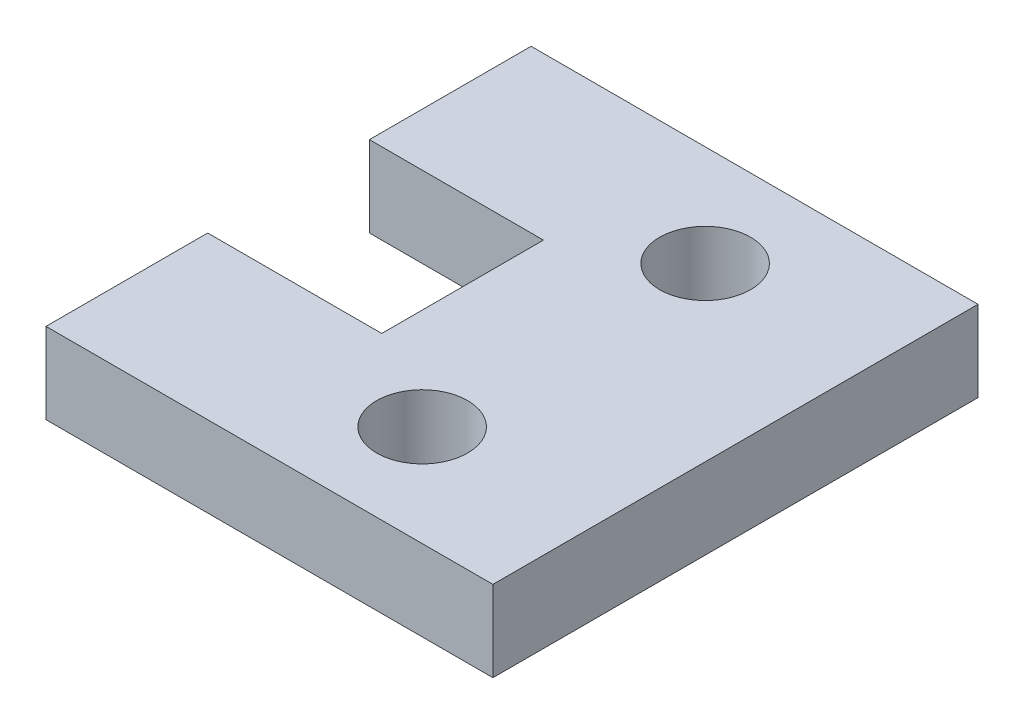
ISO-10303-21;
HEADER;
FILE_DESCRIPTION(('STEP AP214'),'2;1');
FILE_NAME('part.step','',(''),(''),'','','');
FILE_SCHEMA(('AUTOMOTIVE_DESIGN { 1 0 10303 214 1 1 1 1 }'));
ENDSEC;
DATA;
#1=APPLICATION_CONTEXT('core data for automotive mechanical design processes');
#2=APPLICATION_PROTOCOL_DEFINITION('international standard','automotive_design',2000,#1);
#3=PRODUCT_CONTEXT('',#1,'mechanical');
#4=PRODUCT('Part','Part','',(#3));
#5=PRODUCT_RELATED_PRODUCT_CATEGORY('part','',(#4));
#6=PRODUCT_DEFINITION_FORMATION('','',#4);
#7=PRODUCT_DEFINITION_CONTEXT('part definition',#1,'design');
#8=PRODUCT_DEFINITION('design','',#6,#7);
#9=PRODUCT_DEFINITION_SHAPE('','',#8);
#10=(LENGTH_UNIT() NAMED_UNIT(*) SI_UNIT(.MILLI.,.METRE.));
#11=(NAMED_UNIT(*) PLANE_ANGLE_UNIT() SI_UNIT($,.RADIAN.));
#12=(NAMED_UNIT(*) SI_UNIT($,.STERADIAN.) SOLID_ANGLE_UNIT());
#13=UNCERTAINTY_MEASURE_WITH_UNIT(LENGTH_MEASURE(1.E-05),#10,'distance_accuracy_value','');
#14=(GEOMETRIC_REPRESENTATION_CONTEXT(3) GLOBAL_UNCERTAINTY_ASSIGNED_CONTEXT((#13)) GLOBAL_UNIT_ASSIGNED_CONTEXT((#10,
#11,#12)) REPRESENTATION_CONTEXT('',''));
#15=CARTESIAN_POINT('',(0.,0.,0.));
#16=DIRECTION('',(0.,0.,1.));
#17=DIRECTION('',(1.,0.,0.));
#18=AXIS2_PLACEMENT_3D('',#15,#16,#17);
#19=CARTESIAN_POINT('',(-5.,4.,0.));
#20=DIRECTION('',(-1.,0.,0.));
#21=DIRECTION('',(0.,0.,1.));
#22=AXIS2_PLACEMENT_3D('',#19,#20,#21);
#23=PLANE('',#22);
#24=DIRECTION('',(0.,0.,-1.));
#25=VECTOR('',#24,1.);
#26=CARTESIAN_POINT('',(-5.,0.,0.));
#27=LINE('',#26,#25);
#28=CARTESIAN_POINT('',(-5.,0.,4.));
#29=VERTEX_POINT('',#28);
#30=CARTESIAN_POINT('',(-5.,0.,-4.));
#31=VERTEX_POINT('',#30);
#32=EDGE_CURVE('E136',#29,#31,#27,.T.);
#33=ORIENTED_EDGE('',*,*,#32,.F.);
#34=DIRECTION('',(0.,-1.,0.));
#35=VECTOR('',#34,1.);
#36=CARTESIAN_POINT('',(-5.,4.,4.));
#37=LINE('',#36,#35);
#38=CARTESIAN_POINT('',(-5.,4.,4.));
#39=VERTEX_POINT('',#38);
#40=EDGE_CURVE('E11',#39,#29,#37,.T.);
#41=ORIENTED_EDGE('',*,*,#40,.F.);
#42=DIRECTION('',(0.,0.,-1.));
#43=VECTOR('',#42,1.);
#44=CARTESIAN_POINT('',(-5.,4.,0.));
#45=LINE('',#44,#43);
#46=CARTESIAN_POINT('',(-5.,4.,-4.));
#47=VERTEX_POINT('',#46);
#48=EDGE_CURVE('E159',#39,#47,#45,.T.);
#49=ORIENTED_EDGE('',*,*,#48,.T.);
#50=DIRECTION('',(0.,-1.,0.));
#51=VECTOR('',#50,1.);
#52=CARTESIAN_POINT('',(-5.,4.,-4.));
#53=LINE('',#52,#51);
#54=EDGE_CURVE('E88',#47,#31,#53,.T.);
#55=ORIENTED_EDGE('',*,*,#54,.T.);
#56=EDGE_LOOP('',(#33,#41,#49,#55));
#57=FACE_BOUND('',#56,.T.);
#58=ADVANCED_FACE('F37',(#57),#23,.T.);
#59=CARTESIAN_POINT('',(0.,4.,4.));
#60=DIRECTION('',(0.,0.,1.));
#61=DIRECTION('',(1.,0.,0.));
#62=AXIS2_PLACEMENT_3D('',#59,#60,#61);
#63=PLANE('',#62);
#64=DIRECTION('',(-1.,0.,0.));
#65=VECTOR('',#64,1.);
#66=CARTESIAN_POINT('',(0.,0.,4.));
#67=LINE('',#66,#65);
#68=CARTESIAN_POINT('',(-13.60994599,0.,4.));
#69=VERTEX_POINT('',#68);
#70=EDGE_CURVE('E139',#29,#69,#67,.T.);
#71=ORIENTED_EDGE('',*,*,#70,.T.);
#72=DIRECTION('',(0.,-1.,0.));
#73=VECTOR('',#72,1.);
#74=CARTESIAN_POINT('',(-13.60994599,4.,4.));
#75=LINE('',#74,#73);
#76=CARTESIAN_POINT('',(-13.60994599,4.,4.));
#77=VERTEX_POINT('',#76);
#78=EDGE_CURVE('E45',#77,#69,#75,.T.);
#79=ORIENTED_EDGE('',*,*,#78,.F.);
#80=DIRECTION('',(-1.,0.,0.));
#81=VECTOR('',#80,1.);
#82=CARTESIAN_POINT('',(0.,4.,4.));
#83=LINE('',#82,#81);
#84=EDGE_CURVE('E188',#39,#77,#83,.T.);
#85=ORIENTED_EDGE('',*,*,#84,.F.);
#86=ORIENTED_EDGE('',*,*,#40,.T.);
#87=EDGE_LOOP('',(#71,#79,#85,#86));
#88=FACE_BOUND('',#87,.T.);
#89=ADVANCED_FACE('F192',(#88),#63,.F.);
#90=CARTESIAN_POINT('',(-13.60994599,4.,0.));
#91=DIRECTION('',(1.,0.,0.));
#92=DIRECTION('',(0.,0.,-1.));
#93=AXIS2_PLACEMENT_3D('',#90,#91,#92);
#94=PLANE('',#93);
#95=DIRECTION('',(0.,0.,1.));
#96=VECTOR('',#95,1.);
#97=CARTESIAN_POINT('',(-13.60994599,0.,0.));
#98=LINE('',#97,#96);
#99=CARTESIAN_POINT('',(-13.60994599,0.,12.));
#100=VERTEX_POINT('',#99);
#101=EDGE_CURVE('E141',#69,#100,#98,.T.);
#102=ORIENTED_EDGE('',*,*,#101,.T.);
#103=DIRECTION('',(0.,-1.,0.));
#104=VECTOR('',#103,1.);
#105=CARTESIAN_POINT('',(-13.60994599,4.,12.));
#106=LINE('',#105,#104);
#107=CARTESIAN_POINT('',(-13.60994599,4.,12.));
#108=VERTEX_POINT('',#107);
#109=EDGE_CURVE('E165',#108,#100,#106,.T.);
#110=ORIENTED_EDGE('',*,*,#109,.F.);
#111=DIRECTION('',(0.,0.,1.));
#112=VECTOR('',#111,1.);
#113=CARTESIAN_POINT('',(-13.60994599,4.,0.));
#114=LINE('',#113,#112);
#115=EDGE_CURVE('E174',#77,#108,#114,.T.);
#116=ORIENTED_EDGE('',*,*,#115,.F.);
#117=ORIENTED_EDGE('',*,*,#78,.T.);
#118=EDGE_LOOP('',(#102,#110,#116,#117));
#119=FACE_BOUND('',#118,.T.);
#120=ADVANCED_FACE('F172',(#119),#94,.F.);
#121=CARTESIAN_POINT('',(0.,4.,12.));
#122=DIRECTION('',(0.,0.,-1.));
#123=DIRECTION('',(-1.,0.,0.));
#124=AXIS2_PLACEMENT_3D('',#121,#122,#123);
#125=PLANE('',#124);
#126=DIRECTION('',(1.,0.,0.));
#127=VECTOR('',#126,1.);
#128=CARTESIAN_POINT('',(0.,0.,12.));
#129=LINE('',#128,#127);
#130=CARTESIAN_POINT('',(8.5,0.,12.));
#131=VERTEX_POINT('',#130);
#132=EDGE_CURVE('E143',#100,#131,#129,.T.);
#133=ORIENTED_EDGE('',*,*,#132,.T.);
#134=DIRECTION('',(0.,-1.,0.));
#135=VECTOR('',#134,1.);
#136=CARTESIAN_POINT('',(8.5,4.,12.));
#137=LINE('',#136,#135);
#138=CARTESIAN_POINT('',(8.5,4.,12.));
#139=VERTEX_POINT('',#138);
#140=EDGE_CURVE('E163',#139,#131,#137,.T.);
#141=ORIENTED_EDGE('',*,*,#140,.F.);
#142=DIRECTION('',(1.,0.,0.));
#143=VECTOR('',#142,1.);
#144=CARTESIAN_POINT('',(0.,4.,12.));
#145=LINE('',#144,#143);
#146=EDGE_CURVE('E186',#108,#139,#145,.T.);
#147=ORIENTED_EDGE('',*,*,#146,.F.);
#148=ORIENTED_EDGE('',*,*,#109,.T.);
#149=EDGE_LOOP('',(#133,#141,#147,#148));
#150=FACE_BOUND('',#149,.T.);
#151=ADVANCED_FACE('F184',(#150),#125,.F.);
#152=CARTESIAN_POINT('',(8.5,4.,0.));
#153=DIRECTION('',(1.,0.,0.));
#154=DIRECTION('',(0.,0.,-1.));
#155=AXIS2_PLACEMENT_3D('',#152,#153,#154);
#156=PLANE('',#155);
#157=DIRECTION('',(0.,0.,1.));
#158=VECTOR('',#157,1.);
#159=CARTESIAN_POINT('',(8.5,0.,0.));
#160=LINE('',#159,#158);
#161=CARTESIAN_POINT('',(8.5,0.,-12.));
#162=VERTEX_POINT('',#161);
#163=EDGE_CURVE('E146',#162,#131,#160,.T.);
#164=ORIENTED_EDGE('',*,*,#163,.F.);
#165=DIRECTION('',(0.,-1.,0.));
#166=VECTOR('',#165,1.);
#167=CARTESIAN_POINT('',(8.5,4.,-12.));
#168=LINE('',#167,#166);
#169=CARTESIAN_POINT('',(8.5,4.,-12.));
#170=VERTEX_POINT('',#169);
#171=EDGE_CURVE('E122',#170,#162,#168,.T.);
#172=ORIENTED_EDGE('',*,*,#171,.F.);
#173=DIRECTION('',(0.,0.,1.));
#174=VECTOR('',#173,1.);
#175=CARTESIAN_POINT('',(8.5,4.,0.));
#176=LINE('',#175,#174);
#177=EDGE_CURVE('E115',#170,#139,#176,.T.);
#178=ORIENTED_EDGE('',*,*,#177,.T.);
#179=ORIENTED_EDGE('',*,*,#140,.T.);
#180=EDGE_LOOP('',(#164,#172,#178,#179));
#181=FACE_BOUND('',#180,.T.);
#182=ADVANCED_FACE('F202',(#181),#156,.T.);
#183=CARTESIAN_POINT('',(0.,4.,-12.));
#184=DIRECTION('',(0.,0.,1.));
#185=DIRECTION('',(1.,0.,0.));
#186=AXIS2_PLACEMENT_3D('',#183,#184,#185);
#187=PLANE('',#186);
#188=DIRECTION('',(-1.,0.,0.));
#189=VECTOR('',#188,1.);
#190=CARTESIAN_POINT('',(0.,0.,-12.));
#191=LINE('',#190,#189);
#192=CARTESIAN_POINT('',(-13.60994599,0.,-12.));
#193=VERTEX_POINT('',#192);
#194=EDGE_CURVE('E121',#162,#193,#191,.T.);
#195=ORIENTED_EDGE('',*,*,#194,.T.);
#196=DIRECTION('',(0.,-1.,0.));
#197=VECTOR('',#196,1.);
#198=CARTESIAN_POINT('',(-13.60994599,4.,-12.));
#199=LINE('',#198,#197);
#200=CARTESIAN_POINT('',(-13.60994599,4.,-12.));
#201=VERTEX_POINT('',#200);
#202=EDGE_CURVE('E118',#201,#193,#199,.T.);
#203=ORIENTED_EDGE('',*,*,#202,.F.);
#204=DIRECTION('',(-1.,0.,0.));
#205=VECTOR('',#204,1.);
#206=CARTESIAN_POINT('',(0.,4.,-12.));
#207=LINE('',#206,#205);
#208=EDGE_CURVE('E108',#170,#201,#207,.T.);
#209=ORIENTED_EDGE('',*,*,#208,.F.);
#210=ORIENTED_EDGE('',*,*,#171,.T.);
#211=EDGE_LOOP('',(#195,#203,#209,#210));
#212=FACE_BOUND('',#211,.T.);
#213=ADVANCED_FACE('F119',(#212),#187,.F.);
#214=CARTESIAN_POINT('',(-13.60994599,4.,0.));
#215=DIRECTION('',(1.,0.,0.));
#216=DIRECTION('',(0.,0.,-1.));
#217=AXIS2_PLACEMENT_3D('',#214,#215,#216);
#218=PLANE('',#217);
#219=DIRECTION('',(0.,0.,1.));
#220=VECTOR('',#219,1.);
#221=CARTESIAN_POINT('',(-13.60994599,0.,0.));
#222=LINE('',#221,#220);
#223=CARTESIAN_POINT('',(-13.60994599,0.,-4.));
#224=VERTEX_POINT('',#223);
#225=EDGE_CURVE('E81',#193,#224,#222,.T.);
#226=ORIENTED_EDGE('',*,*,#225,.T.);
#227=DIRECTION('',(0.,-1.,0.));
#228=VECTOR('',#227,1.);
#229=CARTESIAN_POINT('',(-13.60994599,4.,-4.));
#230=LINE('',#229,#228);
#231=CARTESIAN_POINT('',(-13.60994599,4.,-4.));
#232=VERTEX_POINT('',#231);
#233=EDGE_CURVE('E123',#232,#224,#230,.T.);
#234=ORIENTED_EDGE('',*,*,#233,.F.);
#235=DIRECTION('',(0.,0.,1.));
#236=VECTOR('',#235,1.);
#237=CARTESIAN_POINT('',(-13.60994599,4.,0.));
#238=LINE('',#237,#236);
#239=EDGE_CURVE('E113',#201,#232,#238,.T.);
#240=ORIENTED_EDGE('',*,*,#239,.F.);
#241=ORIENTED_EDGE('',*,*,#202,.T.);
#242=EDGE_LOOP('',(#226,#234,#240,#241));
#243=FACE_BOUND('',#242,.T.);
#244=ADVANCED_FACE('F125',(#243),#218,.F.);
#245=CARTESIAN_POINT('',(0.,4.,-7.00000000000125));
#246=DIRECTION('',(0.,-1.,0.));
#247=DIRECTION('',(0.,0.,-1.));
#248=AXIS2_PLACEMENT_3D('',#245,#246,#247);
#249=CYLINDRICAL_SURFACE('',#248,2.25);
#250=CARTESIAN_POINT('',(0.,4.,-7.00000000000125));
#251=DIRECTION('',(0.,1.,0.));
#252=DIRECTION('',(0.,0.,1.));
#253=AXIS2_PLACEMENT_3D('',#250,#251,#252);
#254=CIRCLE('',#253,2.25);
#255=CARTESIAN_POINT('',(0.,4.,-4.75000000000125));
#256=VERTEX_POINT('',#255);
#257=EDGE_CURVE('E127',#256,#256,#254,.T.);
#258=ORIENTED_EDGE('',*,*,#257,.T.);
#259=EDGE_LOOP('',(#258));
#260=FACE_BOUND('',#259,.T.);
#261=CARTESIAN_POINT('',(0.,0.,-7.00000000000125));
#262=DIRECTION('',(0.,1.,0.));
#263=DIRECTION('',(0.,0.,1.));
#264=AXIS2_PLACEMENT_3D('',#261,#262,#263);
#265=CIRCLE('',#264,2.25);
#266=CARTESIAN_POINT('',(0.,0.,-4.75000000000125));
#267=VERTEX_POINT('',#266);
#268=EDGE_CURVE('E153',#267,#267,#265,.T.);
#269=ORIENTED_EDGE('',*,*,#268,.F.);
#270=EDGE_LOOP('',(#269));
#271=FACE_BOUND('',#270,.T.);
#272=ADVANCED_FACE('F210',(#260,#271),#249,.F.);
#273=CARTESIAN_POINT('',(0.,4.,-4.));
#274=DIRECTION('',(0.,0.,-1.));
#275=DIRECTION('',(-1.,0.,0.));
#276=AXIS2_PLACEMENT_3D('',#273,#274,#275);
#277=PLANE('',#276);
#278=DIRECTION('',(1.,0.,0.));
#279=VECTOR('',#278,1.);
#280=CARTESIAN_POINT('',(0.,0.,-4.));
#281=LINE('',#280,#279);
#282=EDGE_CURVE('E151',#224,#31,#281,.T.);
#283=ORIENTED_EDGE('',*,*,#282,.T.);
#284=ORIENTED_EDGE('',*,*,#54,.F.);
#285=DIRECTION('',(1.,0.,0.));
#286=VECTOR('',#285,1.);
#287=CARTESIAN_POINT('',(0.,4.,-4.));
#288=LINE('',#287,#286);
#289=EDGE_CURVE('E53',#232,#47,#288,.T.);
#290=ORIENTED_EDGE('',*,*,#289,.F.);
#291=ORIENTED_EDGE('',*,*,#233,.T.);
#292=EDGE_LOOP('',(#283,#284,#290,#291));
#293=FACE_BOUND('',#292,.T.);
#294=ADVANCED_FACE('F211',(#293),#277,.F.);
#295=CARTESIAN_POINT('',(0.,4.,6.99999999999875));
#296=DIRECTION('',(0.,-1.,0.));
#297=DIRECTION('',(0.,0.,-1.));
#298=AXIS2_PLACEMENT_3D('',#295,#296,#297);
#299=CYLINDRICAL_SURFACE('',#298,2.25);
#300=CARTESIAN_POINT('',(0.,4.,6.99999999999875));
#301=DIRECTION('',(0.,1.,0.));
#302=DIRECTION('',(0.,0.,1.));
#303=AXIS2_PLACEMENT_3D('',#300,#301,#302);
#304=CIRCLE('',#303,2.25);
#305=CARTESIAN_POINT('',(0.,4.,9.24999999999875));
#306=VERTEX_POINT('',#305);
#307=EDGE_CURVE('E133',#306,#306,#304,.T.);
#308=ORIENTED_EDGE('',*,*,#307,.T.);
#309=EDGE_LOOP('',(#308));
#310=FACE_BOUND('',#309,.T.);
#311=CARTESIAN_POINT('',(0.,0.,6.99999999999875));
#312=DIRECTION('',(0.,1.,0.));
#313=DIRECTION('',(0.,0.,1.));
#314=AXIS2_PLACEMENT_3D('',#311,#312,#313);
#315=CIRCLE('',#314,2.25);
#316=CARTESIAN_POINT('',(0.,0.,9.24999999999875));
#317=VERTEX_POINT('',#316);
#318=EDGE_CURVE('E156',#317,#317,#315,.T.);
#319=ORIENTED_EDGE('',*,*,#318,.F.);
#320=EDGE_LOOP('',(#319));
#321=FACE_BOUND('',#320,.T.);
#322=ADVANCED_FACE('F214',(#310,#321),#299,.F.);
#323=CARTESIAN_POINT('',(0.,4.,0.));
#324=DIRECTION('',(0.,1.,0.));
#325=DIRECTION('',(0.,0.,1.));
#326=AXIS2_PLACEMENT_3D('',#323,#324,#325);
#327=PLANE('',#326);
#328=ORIENTED_EDGE('',*,*,#48,.F.);
#329=ORIENTED_EDGE('',*,*,#84,.T.);
#330=ORIENTED_EDGE('',*,*,#115,.T.);
#331=ORIENTED_EDGE('',*,*,#146,.T.);
#332=ORIENTED_EDGE('',*,*,#177,.F.);
#333=ORIENTED_EDGE('',*,*,#208,.T.);
#334=ORIENTED_EDGE('',*,*,#239,.T.);
#335=ORIENTED_EDGE('',*,*,#289,.T.);
#336=EDGE_LOOP('',(#328,#329,#330,#331,#332,#333,#334,#335));
#337=FACE_BOUND('',#336,.T.);
#338=ORIENTED_EDGE('',*,*,#257,.F.);
#339=EDGE_LOOP('',(#338));
#340=FACE_BOUND('',#339,.T.);
#341=ORIENTED_EDGE('',*,*,#307,.F.);
#342=EDGE_LOOP('',(#341));
#343=FACE_BOUND('',#342,.T.);
#344=ADVANCED_FACE('F110',(#337,#340,#343),#327,.T.);
#345=CARTESIAN_POINT('',(0.,0.,0.));
#346=DIRECTION('',(0.,1.,0.));
#347=DIRECTION('',(0.,0.,1.));
#348=AXIS2_PLACEMENT_3D('',#345,#346,#347);
#349=PLANE('',#348);
#350=ORIENTED_EDGE('',*,*,#32,.T.);
#351=ORIENTED_EDGE('',*,*,#282,.F.);
#352=ORIENTED_EDGE('',*,*,#225,.F.);
#353=ORIENTED_EDGE('',*,*,#194,.F.);
#354=ORIENTED_EDGE('',*,*,#163,.T.);
#355=ORIENTED_EDGE('',*,*,#132,.F.);
#356=ORIENTED_EDGE('',*,*,#101,.F.);
#357=ORIENTED_EDGE('',*,*,#70,.F.);
#358=EDGE_LOOP('',(#350,#351,#352,#353,#354,#355,#356,#357));
#359=FACE_BOUND('',#358,.T.);
#360=ORIENTED_EDGE('',*,*,#268,.T.);
#361=EDGE_LOOP('',(#360));
#362=FACE_BOUND('',#361,.T.);
#363=ORIENTED_EDGE('',*,*,#318,.T.);
#364=EDGE_LOOP('',(#363));
#365=FACE_BOUND('',#364,.T.);
#366=ADVANCED_FACE('F179',(#359,#362,#365),#349,.F.);
#367=CLOSED_SHELL('',(#58,#89,#120,#151,#182,#213,#244,#272,#294,#322,#344,#366));
#368=MANIFOLD_SOLID_BREP('B2',#367);
#369=ADVANCED_BREP_SHAPE_REPRESENTATION('',(#18,#368),#14);
#370=SHAPE_DEFINITION_REPRESENTATION(#9,#369);
ENDSEC;
END-ISO-10303-21;
